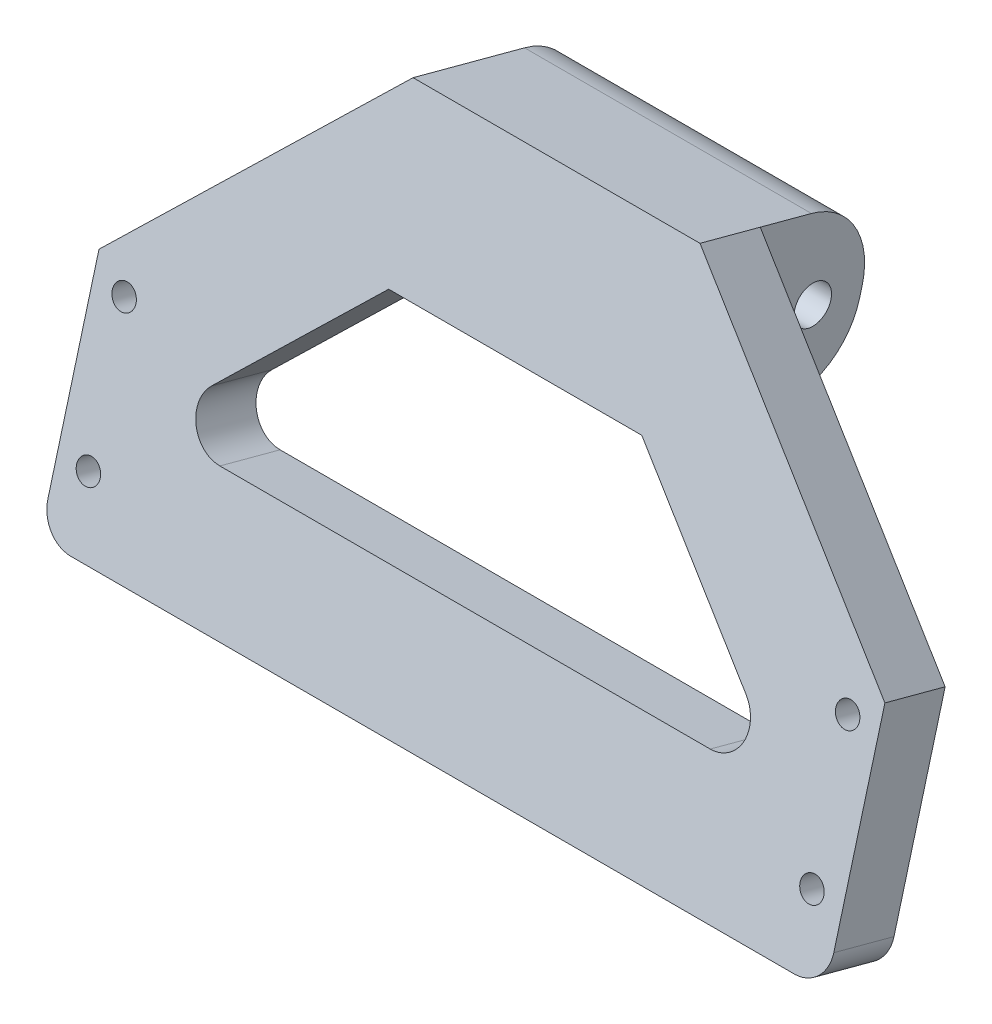
ISO-10303-21;
HEADER;
FILE_DESCRIPTION(('STEP AP214'),'2;1');
FILE_NAME('part.step','',(''),(''),'','','');
FILE_SCHEMA(('AUTOMOTIVE_DESIGN { 1 0 10303 214 1 1 1 1 }'));
ENDSEC;
DATA;
#1=APPLICATION_CONTEXT('core data for automotive mechanical design processes');
#2=APPLICATION_PROTOCOL_DEFINITION('international standard','automotive_design',2000,#1);
#3=PRODUCT_CONTEXT('',#1,'mechanical');
#4=PRODUCT('Part','Part','',(#3));
#5=PRODUCT_RELATED_PRODUCT_CATEGORY('part','',(#4));
#6=PRODUCT_DEFINITION_FORMATION('','',#4);
#7=PRODUCT_DEFINITION_CONTEXT('part definition',#1,'design');
#8=PRODUCT_DEFINITION('design','',#6,#7);
#9=PRODUCT_DEFINITION_SHAPE('','',#8);
#10=(LENGTH_UNIT() NAMED_UNIT(*) SI_UNIT(.MILLI.,.METRE.));
#11=(NAMED_UNIT(*) PLANE_ANGLE_UNIT() SI_UNIT($,.RADIAN.));
#12=(NAMED_UNIT(*) SI_UNIT($,.STERADIAN.) SOLID_ANGLE_UNIT());
#13=UNCERTAINTY_MEASURE_WITH_UNIT(LENGTH_MEASURE(1.E-05),#10,'distance_accuracy_value','');
#14=(GEOMETRIC_REPRESENTATION_CONTEXT(3) GLOBAL_UNCERTAINTY_ASSIGNED_CONTEXT((#13)) GLOBAL_UNIT_ASSIGNED_CONTEXT((#10,
#11,#12)) REPRESENTATION_CONTEXT('',''));
#15=CARTESIAN_POINT('',(0.,0.,0.));
#16=DIRECTION('',(0.,0.,1.));
#17=DIRECTION('',(1.,0.,0.));
#18=AXIS2_PLACEMENT_3D('',#15,#16,#17);
#19=CARTESIAN_POINT('',(-61.,57.4525619683472,40.7320818654844));
#20=DIRECTION('',(0.,0.258819045102521,0.965925826289068));
#21=DIRECTION('',(1.,0.,0.));
#22=AXIS2_PLACEMENT_3D('',#19,#20,#21);
#23=PLANE('',#22);
#24=CARTESIAN_POINT('',(-61.,52.2773266205377,42.1187819975709));
#25=DIRECTION('',(0.,-0.258819045102521,-0.965925826289068));
#26=DIRECTION('',(-1.,0.,0.));
#27=AXIS2_PLACEMENT_3D('',#24,#25,#26);
#28=CIRCLE('',#27,1.9);
#29=CARTESIAN_POINT('',(-59.1,52.2773266205377,42.1187819975709));
#30=VERTEX_POINT('',#29);
#31=EDGE_CURVE('E466',#30,#30,#28,.T.);
#32=ORIENTED_EDGE('',*,*,#31,.T.);
#33=EDGE_LOOP('',(#32));
#34=FACE_BOUND('',#33,.T.);
#35=CARTESIAN_POINT('',(-61.,73.6504575129133,36.3918688352342));
#36=DIRECTION('',(0.,-0.258819045102521,-0.965925826289068));
#37=DIRECTION('',(-1.,0.,0.));
#38=AXIS2_PLACEMENT_3D('',#35,#36,#37);
#39=CIRCLE('',#38,1.9);
#40=CARTESIAN_POINT('',(-59.1,73.6504575129133,36.3918688352342));
#41=VERTEX_POINT('',#40);
#42=EDGE_CURVE('E361',#41,#41,#39,.T.);
#43=ORIENTED_EDGE('',*,*,#42,.T.);
#44=EDGE_LOOP('',(#43));
#45=FACE_BOUND('',#44,.T.);
#46=CARTESIAN_POINT('',(55.,73.6504575129133,36.3918688352342));
#47=DIRECTION('',(0.,0.258819045102521,0.965925826289068));
#48=DIRECTION('',(1.,0.,0.));
#49=AXIS2_PLACEMENT_3D('',#46,#47,#48);
#50=CIRCLE('',#49,1.9);
#51=CARTESIAN_POINT('',(53.1,73.6504575129133,36.3918688352342));
#52=VERTEX_POINT('',#51);
#53=EDGE_CURVE('E388',#52,#52,#50,.T.);
#54=ORIENTED_EDGE('',*,*,#53,.F.);
#55=EDGE_LOOP('',(#54));
#56=FACE_BOUND('',#55,.T.);
#57=CARTESIAN_POINT('',(55.,52.2773266205377,42.1187819975709));
#58=DIRECTION('',(0.,0.258819045102521,0.965925826289068));
#59=DIRECTION('',(1.,0.,0.));
#60=AXIS2_PLACEMENT_3D('',#57,#58,#59);
#61=CIRCLE('',#60,1.9);
#62=CARTESIAN_POINT('',(53.1,52.2773266205377,42.1187819975709));
#63=VERTEX_POINT('',#62);
#64=EDGE_CURVE('E324',#63,#63,#61,.T.);
#65=ORIENTED_EDGE('',*,*,#64,.F.);
#66=EDGE_LOOP('',(#65));
#67=FACE_BOUND('',#66,.T.);
#68=DIRECTION('',(0.707106781186548,0.683012701892219,-0.183012701892219));
#69=VECTOR('',#68,1.);
#70=CARTESIAN_POINT('',(-45.7364567424983,69.5204929334043,37.4984895090828));
#71=LINE('',#70,#69);
#72=CARTESIAN_POINT('',(-45.8431521658773,69.4174330684156,37.5261043166786));
#73=VERTEX_POINT('',#72);
#74=CARTESIAN_POINT('',(-23.2877287525381,91.2042990662452,31.6883311669551));
#75=VERTEX_POINT('',#74);
#76=EDGE_CURVE('E548',#73,#75,#71,.T.);
#77=ORIENTED_EDGE('',*,*,#76,.T.);
#78=DIRECTION('',(1.,0.,0.));
#79=VECTOR('',#78,1.);
#80=CARTESIAN_POINT('',(-63.5,91.2042990662452,31.6883311669551));
#81=LINE('',#80,#79);
#82=CARTESIAN_POINT('',(17.2877287525381,91.2042990662452,31.6883311669551));
#83=VERTEX_POINT('',#82);
#84=EDGE_CURVE('E384',#75,#83,#81,.T.);
#85=ORIENTED_EDGE('',*,*,#84,.T.);
#86=DIRECTION('',(0.707106781186548,-0.683012701892219,0.183012701892219));
#87=VECTOR('',#86,1.);
#88=CARTESIAN_POINT('',(10.7364567424983,97.5323418957873,29.9927372011097));
#89=LINE('',#88,#87);
#90=CARTESIAN_POINT('',(39.8431521658774,69.4174330684156,37.5261043166786));
#91=VERTEX_POINT('',#90);
#92=EDGE_CURVE('E381',#83,#91,#89,.T.);
#93=ORIENTED_EDGE('',*,*,#92,.T.);
#94=CARTESIAN_POINT('',(36.3076182599446,66.0023695589546,38.4411678261396));
#95=DIRECTION('',(0.,0.258819045102521,0.965925826289068));
#96=DIRECTION('',(0.923879532511286,-0.369643810614387,0.0990457605412879));
#97=AXIS2_PLACEMENT_3D('',#94,#95,#96);
#98=CIRCLE('',#97,5.);
#99=CARTESIAN_POINT('',(36.3076182599446,61.1727404275092,39.7352630516522));
#100=VERTEX_POINT('',#99);
#101=EDGE_CURVE('E342',#100,#91,#98,.T.);
#102=ORIENTED_EDGE('',*,*,#101,.F.);
#103=DIRECTION('',(-1.,0.,0.));
#104=VECTOR('',#103,1.);
#105=CARTESIAN_POINT('',(-58.5,61.1727404275092,39.7352630516522));
#106=LINE('',#105,#104);
#107=CARTESIAN_POINT('',(-42.3076182599446,61.1727404275092,39.7352630516522));
#108=VERTEX_POINT('',#107);
#109=EDGE_CURVE('E399',#100,#108,#106,.T.);
#110=ORIENTED_EDGE('',*,*,#109,.T.);
#111=CARTESIAN_POINT('',(-42.3076182599446,66.0023695589546,38.4411678261396));
#112=DIRECTION('',(0.,0.258819045102521,0.965925826289068));
#113=DIRECTION('',(-0.923879532511286,-0.369643810614388,0.0990457605412881));
#114=AXIS2_PLACEMENT_3D('',#111,#112,#113);
#115=CIRCLE('',#114,5.);
#116=EDGE_CURVE('E395',#73,#108,#115,.T.);
#117=ORIENTED_EDGE('',*,*,#116,.F.);
#118=EDGE_LOOP('',(#77,#85,#93,#102,#110,#117));
#119=FACE_BOUND('',#118,.T.);
#120=DIRECTION('',(0.,-0.965925826289069,0.25881904510252));
#121=VECTOR('',#120,1.);
#122=CARTESIAN_POINT('',(-66.,52.9380237073335,41.9417487467224));
#123=LINE('',#122,#121);
#124=CARTESIAN_POINT('',(-66.,77.2679212445465,35.4225723496942));
#125=VERTEX_POINT('',#124);
#126=CARTESIAN_POINT('',(-66.,46.6838530331732,43.6175487281901));
#127=VERTEX_POINT('',#126);
#128=EDGE_CURVE('E376',#125,#127,#123,.T.);
#129=ORIENTED_EDGE('',*,*,#128,.T.);
#130=CARTESIAN_POINT('',(-61.,46.6838530331732,43.6175487281901));
#131=DIRECTION('',(0.,-0.258819045102521,-0.965925826289068));
#132=DIRECTION('',(-0.707106781186548,-0.683012701892219,0.183012701892219));
#133=AXIS2_PLACEMENT_3D('',#130,#131,#132);
#134=CIRCLE('',#133,5.);
#135=CARTESIAN_POINT('',(-61.,41.8542239017278,44.9116439537027));
#136=VERTEX_POINT('',#135);
#137=EDGE_CURVE('E299',#136,#127,#134,.T.);
#138=ORIENTED_EDGE('',*,*,#137,.F.);
#139=DIRECTION('',(1.,0.,0.));
#140=VECTOR('',#139,1.);
#141=CARTESIAN_POINT('',(-58.5,41.8542239017278,44.9116439537027));
#142=LINE('',#141,#140);
#143=CARTESIAN_POINT('',(55.,41.8542239017278,44.9116439537027));
#144=VERTEX_POINT('',#143);
#145=EDGE_CURVE('E302',#136,#144,#142,.T.);
#146=ORIENTED_EDGE('',*,*,#145,.T.);
#147=CARTESIAN_POINT('',(55.,46.6838530331732,43.6175487281901));
#148=DIRECTION('',(0.,0.258819045102521,0.965925826289068));
#149=DIRECTION('',(0.707106781186548,-0.683012701892219,0.183012701892219));
#150=AXIS2_PLACEMENT_3D('',#147,#148,#149);
#151=CIRCLE('',#150,5.);
#152=CARTESIAN_POINT('',(60.,46.6838530331732,43.6175487281901));
#153=VERTEX_POINT('',#152);
#154=EDGE_CURVE('E442',#144,#153,#151,.T.);
#155=ORIENTED_EDGE('',*,*,#154,.T.);
#156=DIRECTION('',(0.,-0.965925826289069,0.25881904510252));
#157=VECTOR('',#156,1.);
#158=CARTESIAN_POINT('',(60.,52.9380237073335,41.9417487467224));
#159=LINE('',#158,#157);
#160=CARTESIAN_POINT('',(60.,77.2679212445465,35.4225723496942));
#161=VERTEX_POINT('',#160);
#162=EDGE_CURVE('E451',#161,#153,#159,.T.);
#163=ORIENTED_EDGE('',*,*,#162,.F.);
#164=DIRECTION('',(-0.707106781186548,0.683012701892219,-0.183012701892219));
#165=VECTOR('',#164,1.);
#166=CARTESIAN_POINT('',(24.8785923662293,111.192595933632,26.3324831632653));
#167=LINE('',#166,#165);
#168=CARTESIAN_POINT('',(20.,115.904954296109,25.0698105455934));
#169=VERTEX_POINT('',#168);
#170=EDGE_CURVE('E28',#161,#169,#167,.T.);
#171=ORIENTED_EDGE('',*,*,#170,.T.);
#172=DIRECTION('',(-1.,0.,0.));
#173=VECTOR('',#172,1.);
#174=CARTESIAN_POINT('',(-63.5,115.904954296109,25.0698105455934));
#175=LINE('',#174,#173);
#176=CARTESIAN_POINT('',(-26.,115.904954296109,25.0698105455934));
#177=VERTEX_POINT('',#176);
#178=EDGE_CURVE('E372',#169,#177,#175,.T.);
#179=ORIENTED_EDGE('',*,*,#178,.T.);
#180=DIRECTION('',(0.707106781186548,0.683012701892219,-0.183012701892219));
#181=VECTOR('',#180,1.);
#182=CARTESIAN_POINT('',(-59.8785923662293,83.1807469712487,33.8382354712384));
#183=LINE('',#182,#181);
#184=EDGE_CURVE('E377',#125,#177,#183,.T.);
#185=ORIENTED_EDGE('',*,*,#184,.F.);
#186=EDGE_LOOP('',(#129,#138,#146,#155,#163,#171,#179,#185));
#187=FACE_BOUND('',#186,.T.);
#188=ADVANCED_FACE('F17',(#34,#45,#56,#67,#119,#187),#23,.T.);
#189=CARTESIAN_POINT('',(20.,89.5823235725168,21.7701763865418));
#190=DIRECTION('',(0.,-0.965925826289068,0.258819045102521));
#191=DIRECTION('',(-1.,0.,0.));
#192=AXIS2_PLACEMENT_3D('',#189,#190,#191);
#193=PLANE('',#192);
#194=DIRECTION('',(-1.,0.,0.));
#195=VECTOR('',#194,1.);
#196=CARTESIAN_POINT('',(14.5,89.5823235725168,21.7701763865418));
#197=LINE('',#196,#195);
#198=CARTESIAN_POINT('',(20.,89.5823235725168,21.7701763865418));
#199=VERTEX_POINT('',#198);
#200=CARTESIAN_POINT('',(-26.,89.5823235725168,21.7701763865418));
#201=VERTEX_POINT('',#200);
#202=EDGE_CURVE('E404',#199,#201,#197,.T.);
#203=ORIENTED_EDGE('',*,*,#202,.T.);
#204=DIRECTION('',(0.,-0.25881904510252,-0.965925826289069));
#205=VECTOR('',#204,1.);
#206=CARTESIAN_POINT('',(-26.,89.5823235725168,21.7701763865418));
#207=LINE('',#206,#205);
#208=CARTESIAN_POINT('',(-26.,87.3823616891454,13.5598068630847));
#209=VERTEX_POINT('',#208);
#210=EDGE_CURVE('E514',#201,#209,#207,.T.);
#211=ORIENTED_EDGE('',*,*,#210,.T.);
#212=DIRECTION('',(-1.,0.,0.));
#213=VECTOR('',#212,1.);
#214=CARTESIAN_POINT('',(8.5,87.3823616891454,13.5598068630847));
#215=LINE('',#214,#213);
#216=CARTESIAN_POINT('',(20.,87.3823616891454,13.5598068630847));
#217=VERTEX_POINT('',#216);
#218=EDGE_CURVE('E336',#217,#209,#215,.T.);
#219=ORIENTED_EDGE('',*,*,#218,.F.);
#220=DIRECTION('',(0.,-0.25881904510252,-0.965925826289069));
#221=VECTOR('',#220,1.);
#222=CARTESIAN_POINT('',(20.,89.5823235725168,21.7701763865418));
#223=LINE('',#222,#221);
#224=EDGE_CURVE('E11',#199,#217,#223,.T.);
#225=ORIENTED_EDGE('',*,*,#224,.F.);
#226=EDGE_LOOP('',(#203,#211,#219,#225));
#227=FACE_BOUND('',#226,.T.);
#228=ADVANCED_FACE('F644',(#227),#193,.T.);
#229=CARTESIAN_POINT('',(20.,89.5823235725168,21.7701763865418));
#230=DIRECTION('',(-1.,0.,0.));
#231=DIRECTION('',(0.,0.,1.));
#232=AXIS2_PLACEMENT_3D('',#229,#230,#231);
#233=PLANE('',#232);
#234=CARTESIAN_POINT('',(20.,98.3380441089851,6.97808974038123));
#235=DIRECTION('',(1.,0.,0.));
#236=DIRECTION('',(0.,0.965925826289068,-0.258819045102521));
#237=AXIS2_PLACEMENT_3D('',#234,#235,#236);
#238=CIRCLE('',#237,3.);
#239=CARTESIAN_POINT('',(20.,95.4402666301179,7.75454687568879));
#240=VERTEX_POINT('',#239);
#241=EDGE_CURVE('E523',#240,#240,#238,.T.);
#242=ORIENTED_EDGE('',*,*,#241,.F.);
#243=EDGE_LOOP('',(#242));
#244=FACE_BOUND('',#243,.T.);
#245=CARTESIAN_POINT('',(20.,98.4905086914697,10.5833878444057));
#246=DIRECTION('',(1.,0.,0.));
#247=DIRECTION('',(0.,-0.866025403784439,-0.5));
#248=AXIS2_PLACEMENT_3D('',#245,#246,#247);
#249=CIRCLE('',#248,11.5);
#250=CARTESIAN_POINT('',(20.,95.5140896727907,-0.524759157918545));
#251=VERTEX_POINT('',#250);
#252=EDGE_CURVE('E313',#217,#251,#249,.T.);
#253=ORIENTED_EDGE('',*,*,#252,.T.);
#254=DIRECTION('',(0.,0.965925826289069,-0.25881904510252));
#255=VECTOR('',#254,1.);
#256=CARTESIAN_POINT('',(20.,90.3395527386082,0.861753834800667));
#257=LINE('',#256,#255);
#258=CARTESIAN_POINT('',(20.,97.0322359407093,-0.931545224399665));
#259=VERTEX_POINT('',#258);
#260=EDGE_CURVE('E277',#251,#259,#257,.T.);
#261=ORIENTED_EDGE('',*,*,#260,.T.);
#262=CARTESIAN_POINT('',(20.,100.008654959388,10.1766017779246));
#263=DIRECTION('',(1.,0.,0.));
#264=DIRECTION('',(0.,0.5,-0.866025403784438));
#265=AXIS2_PLACEMENT_3D('',#262,#263,#264);
#266=CIRCLE('',#265,11.5);
#267=CARTESIAN_POINT('',(20.,111.116801961713,7.20018275924564));
#268=VERTEX_POINT('',#267);
#269=EDGE_CURVE('E274',#259,#268,#266,.T.);
#270=ORIENTED_EDGE('',*,*,#269,.T.);
#271=DIRECTION('',(0.,-0.25881904510252,-0.965925826289069));
#272=VECTOR('',#271,1.);
#273=CARTESIAN_POINT('',(20.,114.610859070597,20.2401814141481));
#274=LINE('',#273,#272);
#275=CARTESIAN_POINT('',(20.,113.316763845084,15.4105522827027));
#276=VERTEX_POINT('',#275);
#277=EDGE_CURVE('E258',#276,#268,#274,.T.);
#278=ORIENTED_EDGE('',*,*,#277,.F.);
#279=DIRECTION('',(0.,-0.965925826289069,0.25881904510252));
#280=VECTOR('',#279,1.);
#281=CARTESIAN_POINT('',(20.,72.2233475449194,26.4214999945677));
#282=LINE('',#281,#280);
#283=EDGE_CURVE('E400',#276,#199,#282,.T.);
#284=ORIENTED_EDGE('',*,*,#283,.T.);
#285=ORIENTED_EDGE('',*,*,#224,.T.);
#286=EDGE_LOOP('',(#253,#261,#270,#278,#284,#285));
#287=FACE_BOUND('',#286,.T.);
#288=ADVANCED_FACE('F275',(#244,#287),#233,.F.);
#289=CARTESIAN_POINT('',(40.,96.5864377703279,30.2461914476438));
#290=DIRECTION('',(-0.707106781186548,-0.683012701892219,0.183012701892219));
#291=DIRECTION('',(-0.694746590606865,0.719254596676404,0.));
#292=AXIS2_PLACEMENT_3D('',#289,#290,#291);
#293=PLANE('',#292);
#294=DIRECTION('',(0.707106781186548,-0.683012701892219,0.183012701892219));
#295=VECTOR('',#294,1.);
#296=CARTESIAN_POINT('',(53.8785923662293,80.5925565202235,24.1789772083477));
#297=LINE('',#296,#295);
#298=CARTESIAN_POINT('',(60.,74.6797307935213,25.7633140868035));
#299=VERTEX_POINT('',#298);
#300=EDGE_CURVE('E403',#276,#299,#297,.T.);
#301=ORIENTED_EDGE('',*,*,#300,.F.);
#302=DIRECTION('',(0.,-0.25881904510252,-0.965925826289069));
#303=VECTOR('',#302,1.);
#304=CARTESIAN_POINT('',(20.,115.904954296109,25.0698105455934));
#305=LINE('',#304,#303);
#306=EDGE_CURVE('E266',#169,#276,#305,.T.);
#307=ORIENTED_EDGE('',*,*,#306,.F.);
#308=ORIENTED_EDGE('',*,*,#170,.F.);
#309=DIRECTION('',(0.,0.25881904510252,0.965925826289069));
#310=VECTOR('',#309,1.);
#311=CARTESIAN_POINT('',(60.,77.2679212445465,35.4225723496942));
#312=LINE('',#311,#310);
#313=EDGE_CURVE('E446',#299,#161,#312,.T.);
#314=ORIENTED_EDGE('',*,*,#313,.F.);
#315=EDGE_LOOP('',(#301,#307,#308,#314));
#316=FACE_BOUND('',#315,.T.);
#317=ADVANCED_FACE('F596',(#316),#293,.F.);
#318=CARTESIAN_POINT('',(60.,48.4234854463198,43.1514156279604));
#319=DIRECTION('',(-1.,0.,0.));
#320=DIRECTION('',(0.,0.,1.));
#321=AXIS2_PLACEMENT_3D('',#318,#319,#320);
#322=PLANE('',#321);
#323=DIRECTION('',(0.,-0.25881904510252,-0.965925826289069));
#324=VECTOR('',#323,1.);
#325=CARTESIAN_POINT('',(60.,46.6838530331732,43.6175487281901));
#326=LINE('',#325,#324);
#327=CARTESIAN_POINT('',(60.,44.095662582148,33.9582904652994));
#328=VERTEX_POINT('',#327);
#329=EDGE_CURVE('E318',#153,#328,#326,.T.);
#330=ORIENTED_EDGE('',*,*,#329,.T.);
#331=DIRECTION('',(0.,0.965925826289069,-0.25881904510252));
#332=VECTOR('',#331,1.);
#333=CARTESIAN_POINT('',(60.,30.6633293572501,37.5574733053765));
#334=LINE('',#333,#332);
#335=EDGE_CURVE('E333',#328,#299,#334,.T.);
#336=ORIENTED_EDGE('',*,*,#335,.T.);
#337=ORIENTED_EDGE('',*,*,#313,.T.);
#338=ORIENTED_EDGE('',*,*,#162,.T.);
#339=EDGE_LOOP('',(#330,#336,#337,#338));
#340=FACE_BOUND('',#339,.T.);
#341=ADVANCED_FACE('F592',(#340),#322,.F.);
#342=CARTESIAN_POINT('',(55.,46.6838530331732,43.6175487281901));
#343=DIRECTION('',(0.,0.258819045102521,0.965925826289068));
#344=DIRECTION('',(0.707106781186548,-0.683012701892219,0.183012701892219));
#345=AXIS2_PLACEMENT_3D('',#342,#343,#344);
#346=CYLINDRICAL_SURFACE('',#345,5.);
#347=CARTESIAN_POINT('',(55.,44.095662582148,33.9582904652994));
#348=DIRECTION('',(0.,-0.258819045102521,-0.965925826289068));
#349=DIRECTION('',(0.707106781186548,-0.683012701892219,0.183012701892219));
#350=AXIS2_PLACEMENT_3D('',#347,#348,#349);
#351=CIRCLE('',#350,5.);
#352=CARTESIAN_POINT('',(55.,39.2660334507026,35.252385690812));
#353=VERTEX_POINT('',#352);
#354=EDGE_CURVE('E328',#328,#353,#351,.T.);
#355=ORIENTED_EDGE('',*,*,#354,.F.);
#356=ORIENTED_EDGE('',*,*,#329,.F.);
#357=ORIENTED_EDGE('',*,*,#154,.F.);
#358=DIRECTION('',(0.,0.25881904510252,0.965925826289069));
#359=VECTOR('',#358,1.);
#360=CARTESIAN_POINT('',(55.,41.8542239017278,44.9116439537027));
#361=LINE('',#360,#359);
#362=EDGE_CURVE('E314',#353,#144,#361,.T.);
#363=ORIENTED_EDGE('',*,*,#362,.F.);
#364=EDGE_LOOP('',(#355,#356,#357,#363));
#365=FACE_BOUND('',#364,.T.);
#366=ADVANCED_FACE('F590',(#365),#346,.T.);
#367=CARTESIAN_POINT('',(-56.,41.8542239017278,44.9116439537027));
#368=DIRECTION('',(0.,-0.965925826289068,0.258819045102521));
#369=DIRECTION('',(-1.,0.,0.));
#370=AXIS2_PLACEMENT_3D('',#367,#368,#369);
#371=PLANE('',#370);
#372=CARTESIAN_POINT('',(-45.0000008940697,40.5601285026636,40.0820141745536));
#373=DIRECTION('',(0.,0.965925826289068,-0.258819045102521));
#374=DIRECTION('',(1.,0.,0.));
#375=AXIS2_PLACEMENT_3D('',#372,#373,#374);
#376=CIRCLE('',#375,1.4);
#377=CARTESIAN_POINT('',(-46.4000008940697,40.5601285026636,40.0820141745536));
#378=VERTEX_POINT('',#377);
#379=EDGE_CURVE('E391',#378,#378,#376,.T.);
#380=ORIENTED_EDGE('',*,*,#379,.T.);
#381=EDGE_LOOP('',(#380));
#382=FACE_BOUND('',#381,.T.);
#383=CARTESIAN_POINT('',(39.0000008940697,40.5601285026636,40.0820141745536));
#384=DIRECTION('',(0.,-0.965925826289068,0.258819045102521));
#385=DIRECTION('',(-1.,0.,0.));
#386=AXIS2_PLACEMENT_3D('',#383,#384,#385);
#387=CIRCLE('',#386,1.4);
#388=CARTESIAN_POINT('',(40.4000008940697,40.5601285026636,40.0820141745536));
#389=VERTEX_POINT('',#388);
#390=EDGE_CURVE('E337',#389,#389,#387,.T.);
#391=ORIENTED_EDGE('',*,*,#390,.F.);
#392=EDGE_LOOP('',(#391));
#393=FACE_BOUND('',#392,.T.);
#394=ORIENTED_EDGE('',*,*,#145,.F.);
#395=DIRECTION('',(0.,0.25881904510252,0.965925826289069));
#396=VECTOR('',#395,1.);
#397=CARTESIAN_POINT('',(-61.,41.8542239017278,44.9116439537027));
#398=LINE('',#397,#396);
#399=CARTESIAN_POINT('',(-61.,39.2660334507026,35.252385690812));
#400=VERTEX_POINT('',#399);
#401=EDGE_CURVE('E303',#400,#136,#398,.T.);
#402=ORIENTED_EDGE('',*,*,#401,.F.);
#403=DIRECTION('',(-1.,0.,0.));
#404=VECTOR('',#403,1.);
#405=CARTESIAN_POINT('',(-58.5,39.2660334507026,35.252385690812));
#406=LINE('',#405,#404);
#407=EDGE_CURVE('E332',#353,#400,#406,.T.);
#408=ORIENTED_EDGE('',*,*,#407,.F.);
#409=ORIENTED_EDGE('',*,*,#362,.T.);
#410=EDGE_LOOP('',(#394,#402,#408,#409));
#411=FACE_BOUND('',#410,.T.);
#412=ADVANCED_FACE('F586',(#382,#393,#411),#371,.T.);
#413=CARTESIAN_POINT('',(-61.,46.6838530331732,43.6175487281901));
#414=DIRECTION('',(0.,-0.258819045102521,-0.965925826289068));
#415=DIRECTION('',(-0.707106781186548,-0.683012701892219,0.183012701892219));
#416=AXIS2_PLACEMENT_3D('',#413,#414,#415);
#417=CYLINDRICAL_SURFACE('',#416,5.);
#418=CARTESIAN_POINT('',(-61.,44.095662582148,33.9582904652994));
#419=DIRECTION('',(0.,0.258819045102521,0.965925826289068));
#420=DIRECTION('',(-0.707106781186548,-0.683012701892219,0.183012701892219));
#421=AXIS2_PLACEMENT_3D('',#418,#419,#420);
#422=CIRCLE('',#421,5.);
#423=CARTESIAN_POINT('',(-66.,44.095662582148,33.9582904652994));
#424=VERTEX_POINT('',#423);
#425=EDGE_CURVE('E351',#424,#400,#422,.T.);
#426=ORIENTED_EDGE('',*,*,#425,.T.);
#427=ORIENTED_EDGE('',*,*,#401,.T.);
#428=ORIENTED_EDGE('',*,*,#137,.T.);
#429=DIRECTION('',(0.,-0.25881904510252,-0.965925826289069));
#430=VECTOR('',#429,1.);
#431=CARTESIAN_POINT('',(-66.,46.6838530331732,43.6175487281901));
#432=LINE('',#431,#430);
#433=EDGE_CURVE('E373',#127,#424,#432,.T.);
#434=ORIENTED_EDGE('',*,*,#433,.T.);
#435=EDGE_LOOP('',(#426,#427,#428,#434));
#436=FACE_BOUND('',#435,.T.);
#437=ADVANCED_FACE('F583',(#436),#417,.T.);
#438=CARTESIAN_POINT('',(-66.,48.4234854463198,43.1514156279604));
#439=DIRECTION('',(-1.,0.,0.));
#440=DIRECTION('',(0.,0.,1.));
#441=AXIS2_PLACEMENT_3D('',#438,#439,#440);
#442=PLANE('',#441);
#443=ORIENTED_EDGE('',*,*,#433,.F.);
#444=ORIENTED_EDGE('',*,*,#128,.F.);
#445=DIRECTION('',(0.,0.25881904510252,0.965925826289069));
#446=VECTOR('',#445,1.);
#447=CARTESIAN_POINT('',(-66.,77.2679212445465,35.4225723496942));
#448=LINE('',#447,#446);
#449=CARTESIAN_POINT('',(-66.,74.6797307935213,25.7633140868035));
#450=VERTEX_POINT('',#449);
#451=EDGE_CURVE('E422',#450,#125,#448,.T.);
#452=ORIENTED_EDGE('',*,*,#451,.F.);
#453=DIRECTION('',(0.,0.965925826289069,-0.25881904510252));
#454=VECTOR('',#453,1.);
#455=CARTESIAN_POINT('',(-66.,30.6633293572501,37.5574733053765));
#456=LINE('',#455,#454);
#457=EDGE_CURVE('E491',#424,#450,#456,.T.);
#458=ORIENTED_EDGE('',*,*,#457,.F.);
#459=EDGE_LOOP('',(#443,#444,#452,#458));
#460=FACE_BOUND('',#459,.T.);
#461=ADVANCED_FACE('F582',(#460),#442,.T.);
#462=CARTESIAN_POINT('',(-46.,96.5864377703279,30.2461914476438));
#463=DIRECTION('',(-0.707106781186548,0.683012701892219,-0.183012701892219));
#464=DIRECTION('',(-0.250562807085731,0.,0.968100345886375));
#465=AXIS2_PLACEMENT_3D('',#462,#463,#464);
#466=PLANE('',#465);
#467=DIRECTION('',(-0.707106781186548,-0.683012701892219,0.183012701892219));
#468=VECTOR('',#467,1.);
#469=CARTESIAN_POINT('',(-59.8785923662293,80.5925565202235,24.1789772083477));
#470=LINE('',#469,#468);
#471=CARTESIAN_POINT('',(-26.,113.316763845084,15.4105522827027));
#472=VERTEX_POINT('',#471);
#473=EDGE_CURVE('E498',#472,#450,#470,.T.);
#474=ORIENTED_EDGE('',*,*,#473,.T.);
#475=ORIENTED_EDGE('',*,*,#451,.T.);
#476=ORIENTED_EDGE('',*,*,#184,.T.);
#477=DIRECTION('',(0.,-0.25881904510252,-0.965925826289069));
#478=VECTOR('',#477,1.);
#479=CARTESIAN_POINT('',(-26.,115.904954296109,25.0698105455934));
#480=LINE('',#479,#478);
#481=EDGE_CURVE('E312',#177,#472,#480,.T.);
#482=ORIENTED_EDGE('',*,*,#481,.T.);
#483=EDGE_LOOP('',(#474,#475,#476,#482));
#484=FACE_BOUND('',#483,.T.);
#485=ADVANCED_FACE('F600',(#484),#466,.T.);
#486=CARTESIAN_POINT('',(-26.,89.5823235725168,21.7701763865418));
#487=DIRECTION('',(-1.,0.,0.));
#488=DIRECTION('',(0.,0.,1.));
#489=AXIS2_PLACEMENT_3D('',#486,#487,#488);
#490=PLANE('',#489);
#491=CARTESIAN_POINT('',(-26.,98.3380441089851,6.97808974038123));
#492=DIRECTION('',(1.,0.,0.));
#493=DIRECTION('',(0.,0.965925826289068,-0.258819045102521));
#494=AXIS2_PLACEMENT_3D('',#491,#492,#493);
#495=CIRCLE('',#494,3.);
#496=CARTESIAN_POINT('',(-26.,95.4402666301179,7.75454687568879));
#497=VERTEX_POINT('',#496);
#498=EDGE_CURVE('E352',#497,#497,#495,.T.);
#499=ORIENTED_EDGE('',*,*,#498,.T.);
#500=EDGE_LOOP('',(#499));
#501=FACE_BOUND('',#500,.T.);
#502=CARTESIAN_POINT('',(-26.,98.4905086914697,10.5833878444057));
#503=DIRECTION('',(1.,0.,0.));
#504=DIRECTION('',(0.,-0.866025403784439,-0.5));
#505=AXIS2_PLACEMENT_3D('',#502,#503,#504);
#506=CIRCLE('',#505,11.5);
#507=CARTESIAN_POINT('',(-26.,95.5140896727907,-0.524759157918545));
#508=VERTEX_POINT('',#507);
#509=EDGE_CURVE('E364',#209,#508,#506,.T.);
#510=ORIENTED_EDGE('',*,*,#509,.F.);
#511=ORIENTED_EDGE('',*,*,#210,.F.);
#512=DIRECTION('',(0.,-0.965925826289069,0.25881904510252));
#513=VECTOR('',#512,1.);
#514=CARTESIAN_POINT('',(-26.,72.2233475449194,26.4214999945677));
#515=LINE('',#514,#513);
#516=EDGE_CURVE('E488',#472,#201,#515,.T.);
#517=ORIENTED_EDGE('',*,*,#516,.F.);
#518=DIRECTION('',(0.,-0.25881904510252,-0.965925826289069));
#519=VECTOR('',#518,1.);
#520=CARTESIAN_POINT('',(-26.,114.610859070597,20.2401814141481));
#521=LINE('',#520,#519);
#522=CARTESIAN_POINT('',(-26.,111.116801961713,7.20018275924564));
#523=VERTEX_POINT('',#522);
#524=EDGE_CURVE('E309',#472,#523,#521,.T.);
#525=ORIENTED_EDGE('',*,*,#524,.T.);
#526=CARTESIAN_POINT('',(-26.,100.008654959388,10.1766017779246));
#527=DIRECTION('',(1.,0.,0.));
#528=DIRECTION('',(0.,0.5,-0.866025403784438));
#529=AXIS2_PLACEMENT_3D('',#526,#527,#528);
#530=CIRCLE('',#529,11.5);
#531=CARTESIAN_POINT('',(-26.,97.0322359407093,-0.931545224399665));
#532=VERTEX_POINT('',#531);
#533=EDGE_CURVE('E286',#532,#523,#530,.T.);
#534=ORIENTED_EDGE('',*,*,#533,.F.);
#535=DIRECTION('',(0.,0.965925826289069,-0.25881904510252));
#536=VECTOR('',#535,1.);
#537=CARTESIAN_POINT('',(-26.,90.3395527386082,0.861753834800667));
#538=LINE('',#537,#536);
#539=EDGE_CURVE('E325',#508,#532,#538,.T.);
#540=ORIENTED_EDGE('',*,*,#539,.F.);
#541=EDGE_LOOP('',(#510,#511,#517,#525,#534,#540));
#542=FACE_BOUND('',#541,.T.);
#543=ADVANCED_FACE('F654',(#501,#542),#490,.T.);
#544=CARTESIAN_POINT('',(-61.,49.947955214615,33.4254495609693));
#545=DIRECTION('',(0.,-0.258819045102521,-0.965925826289068));
#546=DIRECTION('',(-1.,0.,0.));
#547=AXIS2_PLACEMENT_3D('',#544,#545,#546);
#548=CONICAL_SURFACE('',#547,2.9,0.785398163397448);
#549=CARTESIAN_POINT('',(-61.,49.6891361695125,32.4595237346802));
#550=DIRECTION('',(0.,-0.258819045102521,-0.965925826289068));
#551=DIRECTION('',(-1.,0.,0.));
#552=AXIS2_PLACEMENT_3D('',#549,#550,#551);
#553=CIRCLE('',#552,3.9);
#554=CARTESIAN_POINT('',(-57.1,49.6891361695125,32.4595237346802));
#555=VERTEX_POINT('',#554);
#556=EDGE_CURVE('E485',#555,#555,#553,.T.);
#557=ORIENTED_EDGE('',*,*,#556,.T.);
#558=DIRECTION('',(-0.707106781186548,0.183012701892219,0.683012701892219));
#559=VECTOR('',#558,1.);
#560=CARTESIAN_POINT('',(-58.1,49.947955214615,33.4254495609693));
#561=LINE('',#560,#559);
#562=CARTESIAN_POINT('',(-59.1,50.2067742597176,34.3913753872584));
#563=VERTEX_POINT('',#562);
#564=EDGE_CURVE('E439',#555,#563,#561,.T.);
#565=ORIENTED_EDGE('',*,*,#564,.T.);
#566=CARTESIAN_POINT('',(-61.,50.2067742597176,34.3913753872584));
#567=DIRECTION('',(0.,0.258819045102521,0.965925826289068));
#568=DIRECTION('',(-1.,0.,0.));
#569=AXIS2_PLACEMENT_3D('',#566,#567,#568);
#570=CIRCLE('',#569,1.9);
#571=EDGE_CURVE('E356',#563,#563,#570,.T.);
#572=ORIENTED_EDGE('',*,*,#571,.T.);
#573=ORIENTED_EDGE('',*,*,#564,.F.);
#574=EDGE_LOOP('',(#557,#565,#572,#573));
#575=FACE_BOUND('',#574,.T.);
#576=ADVANCED_FACE('F656',(#575),#548,.F.);
#577=CARTESIAN_POINT('',(55.,49.947955214615,33.4254495609693));
#578=DIRECTION('',(0.,-0.258819045102521,-0.965925826289068));
#579=DIRECTION('',(1.,0.,0.));
#580=AXIS2_PLACEMENT_3D('',#577,#578,#579);
#581=CONICAL_SURFACE('',#580,2.9,0.785398163397448);
#582=CARTESIAN_POINT('',(55.,50.2067742597176,34.3913753872584));
#583=DIRECTION('',(0.,0.258819045102521,0.965925826289068));
#584=DIRECTION('',(1.,0.,0.));
#585=AXIS2_PLACEMENT_3D('',#582,#583,#584);
#586=CIRCLE('',#585,1.9);
#587=CARTESIAN_POINT('',(53.1,50.2067742597176,34.3913753872584));
#588=VERTEX_POINT('',#587);
#589=EDGE_CURVE('E369',#588,#588,#586,.T.);
#590=ORIENTED_EDGE('',*,*,#589,.T.);
#591=DIRECTION('',(-0.707106781186548,-0.183012701892219,-0.683012701892219));
#592=VECTOR('',#591,1.);
#593=CARTESIAN_POINT('',(52.1,49.947955214615,33.4254495609693));
#594=LINE('',#593,#592);
#595=CARTESIAN_POINT('',(51.1,49.6891361695125,32.4595237346802));
#596=VERTEX_POINT('',#595);
#597=EDGE_CURVE('E436',#588,#596,#594,.T.);
#598=ORIENTED_EDGE('',*,*,#597,.T.);
#599=CARTESIAN_POINT('',(55.,49.6891361695125,32.4595237346802));
#600=DIRECTION('',(0.,-0.258819045102521,-0.965925826289068));
#601=DIRECTION('',(1.,0.,0.));
#602=AXIS2_PLACEMENT_3D('',#599,#600,#601);
#603=CIRCLE('',#602,3.9);
#604=EDGE_CURVE('E473',#596,#596,#603,.T.);
#605=ORIENTED_EDGE('',*,*,#604,.T.);
#606=ORIENTED_EDGE('',*,*,#597,.F.);
#607=EDGE_LOOP('',(#590,#598,#605,#606));
#608=FACE_BOUND('',#607,.T.);
#609=ADVANCED_FACE('F665',(#608),#581,.F.);
#610=CARTESIAN_POINT('',(55.,71.3210861069906,27.6985363986326));
#611=DIRECTION('',(0.,-0.258819045102521,-0.965925826289068));
#612=DIRECTION('',(1.,0.,0.));
#613=AXIS2_PLACEMENT_3D('',#610,#611,#612);
#614=CONICAL_SURFACE('',#613,2.9,0.785398163397448);
#615=CARTESIAN_POINT('',(55.,71.5799051520932,28.6644622249217));
#616=DIRECTION('',(0.,0.258819045102521,0.965925826289068));
#617=DIRECTION('',(1.,0.,0.));
#618=AXIS2_PLACEMENT_3D('',#615,#616,#617);
#619=CIRCLE('',#618,1.9);
#620=CARTESIAN_POINT('',(53.1,71.5799051520932,28.6644622249217));
#621=VERTEX_POINT('',#620);
#622=EDGE_CURVE('E319',#621,#621,#619,.T.);
#623=ORIENTED_EDGE('',*,*,#622,.T.);
#624=DIRECTION('',(-0.707106781186548,-0.183012701892219,-0.683012701892219));
#625=VECTOR('',#624,1.);
#626=CARTESIAN_POINT('',(52.1,71.3210861069906,27.6985363986326));
#627=LINE('',#626,#625);
#628=CARTESIAN_POINT('',(51.1,71.0622670618881,26.7326105723435));
#629=VERTEX_POINT('',#628);
#630=EDGE_CURVE('E297',#621,#629,#627,.T.);
#631=ORIENTED_EDGE('',*,*,#630,.T.);
#632=CARTESIAN_POINT('',(55.,71.0622670618881,26.7326105723435));
#633=DIRECTION('',(0.,-0.258819045102521,-0.965925826289068));
#634=DIRECTION('',(1.,0.,0.));
#635=AXIS2_PLACEMENT_3D('',#632,#633,#634);
#636=CIRCLE('',#635,3.9);
#637=EDGE_CURVE('E307',#629,#629,#636,.T.);
#638=ORIENTED_EDGE('',*,*,#637,.T.);
#639=ORIENTED_EDGE('',*,*,#630,.F.);
#640=EDGE_LOOP('',(#623,#631,#638,#639));
#641=FACE_BOUND('',#640,.T.);
#642=ADVANCED_FACE('F19',(#641),#614,.F.);
#643=CARTESIAN_POINT('',(-61.,71.3210861069906,27.6985363986326));
#644=DIRECTION('',(0.,-0.258819045102521,-0.965925826289068));
#645=DIRECTION('',(-1.,0.,0.));
#646=AXIS2_PLACEMENT_3D('',#643,#644,#645);
#647=CONICAL_SURFACE('',#646,2.9,0.785398163397448);
#648=CARTESIAN_POINT('',(-61.,71.0622670618881,26.7326105723435));
#649=DIRECTION('',(0.,-0.258819045102521,-0.965925826289068));
#650=DIRECTION('',(-1.,0.,0.));
#651=AXIS2_PLACEMENT_3D('',#648,#649,#650);
#652=CIRCLE('',#651,3.9);
#653=CARTESIAN_POINT('',(-57.1,71.0622670618881,26.7326105723435));
#654=VERTEX_POINT('',#653);
#655=EDGE_CURVE('E464',#654,#654,#652,.T.);
#656=ORIENTED_EDGE('',*,*,#655,.T.);
#657=DIRECTION('',(-0.707106781186548,0.183012701892219,0.683012701892219));
#658=VECTOR('',#657,1.);
#659=CARTESIAN_POINT('',(-58.1,71.3210861069906,27.6985363986326));
#660=LINE('',#659,#658);
#661=CARTESIAN_POINT('',(-59.1,71.5799051520932,28.6644622249217));
#662=VERTEX_POINT('',#661);
#663=EDGE_CURVE('E387',#654,#662,#660,.T.);
#664=ORIENTED_EDGE('',*,*,#663,.T.);
#665=CARTESIAN_POINT('',(-61.,71.5799051520932,28.6644622249217));
#666=DIRECTION('',(0.,0.258819045102521,0.965925826289068));
#667=DIRECTION('',(-1.,0.,0.));
#668=AXIS2_PLACEMENT_3D('',#665,#666,#667);
#669=CIRCLE('',#668,1.9);
#670=EDGE_CURVE('E271',#662,#662,#669,.T.);
#671=ORIENTED_EDGE('',*,*,#670,.T.);
#672=ORIENTED_EDGE('',*,*,#663,.F.);
#673=EDGE_LOOP('',(#656,#664,#671,#672));
#674=FACE_BOUND('',#673,.T.);
#675=ADVANCED_FACE('F729',(#674),#647,.F.);
#676=CARTESIAN_POINT('',(-66.,91.2042990662452,31.6883311669551));
#677=DIRECTION('',(0.,0.965925826289068,-0.258819045102521));
#678=DIRECTION('',(-1.,0.,0.));
#679=AXIS2_PLACEMENT_3D('',#676,#677,#678);
#680=PLANE('',#679);
#681=DIRECTION('',(-1.,0.,0.));
#682=VECTOR('',#681,1.);
#683=CARTESIAN_POINT('',(-63.5,88.61610861522,22.0290729040644));
#684=LINE('',#683,#682);
#685=CARTESIAN_POINT('',(17.2877287525381,88.61610861522,22.0290729040644));
#686=VERTEX_POINT('',#685);
#687=CARTESIAN_POINT('',(-23.2877287525381,88.61610861522,22.0290729040644));
#688=VERTEX_POINT('',#687);
#689=EDGE_CURVE('E304',#686,#688,#684,.T.);
#690=ORIENTED_EDGE('',*,*,#689,.F.);
#691=DIRECTION('',(0.,-0.25881904510252,-0.965925826289069));
#692=VECTOR('',#691,1.);
#693=CARTESIAN_POINT('',(17.2877287525381,91.2042990662452,31.6883311669551));
#694=LINE('',#693,#692);
#695=EDGE_CURVE('E378',#83,#686,#694,.T.);
#696=ORIENTED_EDGE('',*,*,#695,.F.);
#697=ORIENTED_EDGE('',*,*,#84,.F.);
#698=DIRECTION('',(0.,-0.25881904510252,-0.965925826289069));
#699=VECTOR('',#698,1.);
#700=CARTESIAN_POINT('',(-23.2877287525381,91.2042990662452,31.6883311669551));
#701=LINE('',#700,#699);
#702=EDGE_CURVE('E536',#75,#688,#701,.T.);
#703=ORIENTED_EDGE('',*,*,#702,.T.);
#704=EDGE_LOOP('',(#690,#696,#697,#703));
#705=FACE_BOUND('',#704,.T.);
#706=ADVANCED_FACE('F717',(#705),#680,.F.);
#707=CARTESIAN_POINT('',(55.,73.6504575129133,36.3918688352342));
#708=DIRECTION('',(0.,0.258819045102521,0.965925826289068));
#709=DIRECTION('',(1.,0.,0.));
#710=AXIS2_PLACEMENT_3D('',#707,#708,#709);
#711=CYLINDRICAL_SURFACE('',#710,1.9);
#712=ORIENTED_EDGE('',*,*,#622,.F.);
#713=DIRECTION('',(0.,0.258819045102521,0.965925826289068));
#714=VECTOR('',#713,1.);
#715=CARTESIAN_POINT('',(53.1,73.6504575129133,36.3918688352342));
#716=LINE('',#715,#714);
#717=EDGE_CURVE('E323',#621,#52,#716,.T.);
#718=ORIENTED_EDGE('',*,*,#717,.T.);
#719=ORIENTED_EDGE('',*,*,#53,.T.);
#720=ORIENTED_EDGE('',*,*,#717,.F.);
#721=EDGE_LOOP('',(#712,#718,#719,#720));
#722=FACE_BOUND('',#721,.T.);
#723=ADVANCED_FACE('F713',(#722),#711,.F.);
#724=CARTESIAN_POINT('',(55.,52.2773266205377,42.1187819975709));
#725=DIRECTION('',(0.,0.258819045102521,0.965925826289068));
#726=DIRECTION('',(1.,0.,0.));
#727=AXIS2_PLACEMENT_3D('',#724,#725,#726);
#728=CYLINDRICAL_SURFACE('',#727,1.9);
#729=ORIENTED_EDGE('',*,*,#589,.F.);
#730=DIRECTION('',(0.,0.258819045102521,0.965925826289068));
#731=VECTOR('',#730,1.);
#732=CARTESIAN_POINT('',(53.1,52.2773266205377,42.1187819975709));
#733=LINE('',#732,#731);
#734=EDGE_CURVE('E365',#588,#63,#733,.T.);
#735=ORIENTED_EDGE('',*,*,#734,.T.);
#736=ORIENTED_EDGE('',*,*,#64,.T.);
#737=ORIENTED_EDGE('',*,*,#734,.F.);
#738=EDGE_LOOP('',(#729,#735,#736,#737));
#739=FACE_BOUND('',#738,.T.);
#740=ADVANCED_FACE('F716',(#739),#728,.F.);
#741=CARTESIAN_POINT('',(-61.,52.2773266205377,42.1187819975709));
#742=DIRECTION('',(0.,-0.258819045102521,-0.965925826289068));
#743=DIRECTION('',(-1.,0.,0.));
#744=AXIS2_PLACEMENT_3D('',#741,#742,#743);
#745=CYLINDRICAL_SURFACE('',#744,1.9);
#746=ORIENTED_EDGE('',*,*,#571,.F.);
#747=DIRECTION('',(0.,0.258819045102521,0.965925826289068));
#748=VECTOR('',#747,1.);
#749=CARTESIAN_POINT('',(-59.1,52.2773266205377,42.1187819975709));
#750=LINE('',#749,#748);
#751=EDGE_CURVE('E360',#563,#30,#750,.T.);
#752=ORIENTED_EDGE('',*,*,#751,.T.);
#753=ORIENTED_EDGE('',*,*,#31,.F.);
#754=ORIENTED_EDGE('',*,*,#751,.F.);
#755=EDGE_LOOP('',(#746,#752,#753,#754));
#756=FACE_BOUND('',#755,.T.);
#757=ADVANCED_FACE('F733',(#756),#745,.F.);
#758=CARTESIAN_POINT('',(-61.,73.6504575129133,36.3918688352342));
#759=DIRECTION('',(0.,-0.258819045102521,-0.965925826289068));
#760=DIRECTION('',(-1.,0.,0.));
#761=AXIS2_PLACEMENT_3D('',#758,#759,#760);
#762=CYLINDRICAL_SURFACE('',#761,1.9);
#763=ORIENTED_EDGE('',*,*,#670,.F.);
#764=DIRECTION('',(0.,0.258819045102521,0.965925826289068));
#765=VECTOR('',#764,1.);
#766=CARTESIAN_POINT('',(-59.1,73.6504575129133,36.3918688352342));
#767=LINE('',#766,#765);
#768=EDGE_CURVE('E407',#662,#41,#767,.T.);
#769=ORIENTED_EDGE('',*,*,#768,.T.);
#770=ORIENTED_EDGE('',*,*,#42,.F.);
#771=ORIENTED_EDGE('',*,*,#768,.F.);
#772=EDGE_LOOP('',(#763,#769,#770,#771));
#773=FACE_BOUND('',#772,.T.);
#774=ADVANCED_FACE('F684',(#773),#762,.F.);
#775=CARTESIAN_POINT('',(-66.,115.904954296109,25.0698105455934));
#776=DIRECTION('',(0.,0.965925826289068,-0.258819045102521));
#777=DIRECTION('',(-1.,0.,0.));
#778=AXIS2_PLACEMENT_3D('',#775,#776,#777);
#779=PLANE('',#778);
#780=DIRECTION('',(1.,0.,0.));
#781=VECTOR('',#780,1.);
#782=CARTESIAN_POINT('',(-34.5,111.116801961713,7.20018275924564));
#783=LINE('',#782,#781);
#784=EDGE_CURVE('E263',#523,#268,#783,.T.);
#785=ORIENTED_EDGE('',*,*,#784,.F.);
#786=ORIENTED_EDGE('',*,*,#524,.F.);
#787=ORIENTED_EDGE('',*,*,#481,.F.);
#788=ORIENTED_EDGE('',*,*,#178,.F.);
#789=ORIENTED_EDGE('',*,*,#306,.T.);
#790=ORIENTED_EDGE('',*,*,#277,.T.);
#791=EDGE_LOOP('',(#785,#786,#787,#788,#789,#790));
#792=FACE_BOUND('',#791,.T.);
#793=ADVANCED_FACE('F260',(#792),#779,.T.);
#794=CARTESIAN_POINT('',(8.5,98.4905086914697,10.5833878444057));
#795=DIRECTION('',(-1.,0.,0.));
#796=DIRECTION('',(0.,-0.866025403784439,-0.5));
#797=AXIS2_PLACEMENT_3D('',#794,#795,#796);
#798=CYLINDRICAL_SURFACE('',#797,11.5);
#799=ORIENTED_EDGE('',*,*,#218,.T.);
#800=ORIENTED_EDGE('',*,*,#509,.T.);
#801=DIRECTION('',(-1.,0.,0.));
#802=VECTOR('',#801,1.);
#803=CARTESIAN_POINT('',(-14.5,95.5140896727907,-0.524759157918545));
#804=LINE('',#803,#802);
#805=EDGE_CURVE('E282',#251,#508,#804,.T.);
#806=ORIENTED_EDGE('',*,*,#805,.F.);
#807=ORIENTED_EDGE('',*,*,#252,.F.);
#808=EDGE_LOOP('',(#799,#800,#806,#807));
#809=FACE_BOUND('',#808,.T.);
#810=ADVANCED_FACE('F650',(#809),#798,.T.);
#811=CARTESIAN_POINT('',(-3.,96.27316280675,-0.728152191159105));
#812=DIRECTION('',(0.,-0.258819045102521,-0.965925826289068));
#813=DIRECTION('',(0.,-0.965925826289068,0.258819045102521));
#814=AXIS2_PLACEMENT_3D('',#811,#812,#813);
#815=PLANE('',#814);
#816=ORIENTED_EDGE('',*,*,#805,.T.);
#817=ORIENTED_EDGE('',*,*,#539,.T.);
#818=DIRECTION('',(-1.,0.,0.));
#819=VECTOR('',#818,1.);
#820=CARTESIAN_POINT('',(-34.5,97.0322359407093,-0.931545224399665));
#821=LINE('',#820,#819);
#822=EDGE_CURVE('E293',#259,#532,#821,.T.);
#823=ORIENTED_EDGE('',*,*,#822,.F.);
#824=ORIENTED_EDGE('',*,*,#260,.F.);
#825=EDGE_LOOP('',(#816,#817,#823,#824));
#826=FACE_BOUND('',#825,.T.);
#827=ADVANCED_FACE('F653',(#826),#815,.T.);
#828=CARTESIAN_POINT('',(-34.5,100.008654959388,10.1766017779246));
#829=DIRECTION('',(1.,0.,0.));
#830=DIRECTION('',(0.,0.5,-0.866025403784438));
#831=AXIS2_PLACEMENT_3D('',#828,#829,#830);
#832=CYLINDRICAL_SURFACE('',#831,11.5);
#833=ORIENTED_EDGE('',*,*,#822,.T.);
#834=ORIENTED_EDGE('',*,*,#533,.T.);
#835=ORIENTED_EDGE('',*,*,#784,.T.);
#836=ORIENTED_EDGE('',*,*,#269,.F.);
#837=EDGE_LOOP('',(#833,#834,#835,#836));
#838=FACE_BOUND('',#837,.T.);
#839=ADVANCED_FACE('F284',(#838),#832,.T.);
#840=CARTESIAN_POINT('',(20.,98.3380441089851,6.97808974038123));
#841=DIRECTION('',(-1.,0.,0.));
#842=DIRECTION('',(0.,0.965925826289068,-0.258819045102521));
#843=AXIS2_PLACEMENT_3D('',#840,#841,#842);
#844=CYLINDRICAL_SURFACE('',#843,3.);
#845=ORIENTED_EDGE('',*,*,#241,.T.);
#846=DIRECTION('',(-1.,0.,0.));
#847=VECTOR('',#846,1.);
#848=CARTESIAN_POINT('',(20.,95.4402666301179,7.75454687568879));
#849=LINE('',#848,#847);
#850=EDGE_CURVE('E355',#240,#497,#849,.T.);
#851=ORIENTED_EDGE('',*,*,#850,.T.);
#852=ORIENTED_EDGE('',*,*,#498,.F.);
#853=ORIENTED_EDGE('',*,*,#850,.F.);
#854=EDGE_LOOP('',(#845,#851,#852,#853));
#855=FACE_BOUND('',#854,.T.);
#856=ADVANCED_FACE('F711',(#855),#844,.F.);
#857=CARTESIAN_POINT('',(39.0000008940697,35.7300206071416,41.3762376845139));
#858=DIRECTION('',(0.,-0.965925826289068,0.258819045102521));
#859=DIRECTION('',(-1.,0.,0.));
#860=AXIS2_PLACEMENT_3D('',#857,#858,#859);
#861=CYLINDRICAL_SURFACE('',#860,1.4);
#862=ORIENTED_EDGE('',*,*,#390,.T.);
#863=DIRECTION('',(0.,0.965925826289068,-0.258819045102521));
#864=VECTOR('',#863,1.);
#865=CARTESIAN_POINT('',(40.4000008940697,35.7300206071416,41.3762376845139));
#866=LINE('',#865,#864);
#867=CARTESIAN_POINT('',(40.4000008940697,56.9803887855011,35.6822186922584));
#868=VERTEX_POINT('',#867);
#869=EDGE_CURVE('E21',#389,#868,#866,.T.);
#870=ORIENTED_EDGE('',*,*,#869,.T.);
#871=CARTESIAN_POINT('',(39.0000008940697,56.9803887855011,35.6822186922584));
#872=DIRECTION('',(0.,-0.965925826289068,0.258819045102521));
#873=DIRECTION('',(-1.,0.,0.));
#874=AXIS2_PLACEMENT_3D('',#871,#872,#873);
#875=CIRCLE('',#874,1.4);
#876=EDGE_CURVE('E427',#868,#868,#875,.T.);
#877=ORIENTED_EDGE('',*,*,#876,.F.);
#878=ORIENTED_EDGE('',*,*,#869,.F.);
#879=EDGE_LOOP('',(#862,#870,#877,#878));
#880=FACE_BOUND('',#879,.T.);
#881=ADVANCED_FACE('F707',(#880),#861,.F.);
#882=CARTESIAN_POINT('',(-45.0000008940697,35.7300206071416,41.3762376845139));
#883=DIRECTION('',(0.,0.965925826289068,-0.258819045102521));
#884=DIRECTION('',(1.,0.,0.));
#885=AXIS2_PLACEMENT_3D('',#882,#883,#884);
#886=CYLINDRICAL_SURFACE('',#885,1.4);
#887=ORIENTED_EDGE('',*,*,#379,.F.);
#888=DIRECTION('',(0.,0.965925826289068,-0.258819045102521));
#889=VECTOR('',#888,1.);
#890=CARTESIAN_POINT('',(-46.4000008940697,35.7300206071416,41.3762376845139));
#891=LINE('',#890,#889);
#892=CARTESIAN_POINT('',(-46.4000008940697,56.9803887855011,35.6822186922584));
#893=VERTEX_POINT('',#892);
#894=EDGE_CURVE('E341',#378,#893,#891,.T.);
#895=ORIENTED_EDGE('',*,*,#894,.T.);
#896=CARTESIAN_POINT('',(-45.0000008940697,56.9803887855011,35.6822186922584));
#897=DIRECTION('',(0.,0.965925826289068,-0.258819045102521));
#898=DIRECTION('',(1.,0.,0.));
#899=AXIS2_PLACEMENT_3D('',#896,#897,#898);
#900=CIRCLE('',#899,1.4);
#901=EDGE_CURVE('E423',#893,#893,#900,.T.);
#902=ORIENTED_EDGE('',*,*,#901,.T.);
#903=ORIENTED_EDGE('',*,*,#894,.F.);
#904=EDGE_LOOP('',(#887,#895,#902,#903));
#905=FACE_BOUND('',#904,.T.);
#906=ADVANCED_FACE('F710',(#905),#886,.F.);
#907=CARTESIAN_POINT('',(39.0000008940697,56.9803887855011,35.6822186922584));
#908=DIRECTION('',(0.,0.965925826289068,-0.258819045102521));
#909=DIRECTION('',(-1.,0.,0.));
#910=AXIS2_PLACEMENT_3D('',#907,#908,#909);
#911=PLANE('',#910);
#912=ORIENTED_EDGE('',*,*,#876,.T.);
#913=EDGE_LOOP('',(#912));
#914=FACE_BOUND('',#913,.T.);
#915=ADVANCED_FACE('F719',(#914),#911,.F.);
#916=CARTESIAN_POINT('',(-45.0000008940697,56.9803887855011,35.6822186922584));
#917=DIRECTION('',(0.,-0.965925826289068,0.258819045102521));
#918=DIRECTION('',(-1.,0.,0.));
#919=AXIS2_PLACEMENT_3D('',#916,#917,#918);
#920=PLANE('',#919);
#921=ORIENTED_EDGE('',*,*,#901,.F.);
#922=EDGE_LOOP('',(#921));
#923=FACE_BOUND('',#922,.T.);
#924=ADVANCED_FACE('F722',(#923),#920,.T.);
#925=CARTESIAN_POINT('',(25.857864376269,82.9261837324835,33.9064454854882));
#926=DIRECTION('',(-0.707106781186548,-0.683012701892219,0.183012701892219));
#927=DIRECTION('',(-0.694746590606865,0.719254596676404,0.));
#928=AXIS2_PLACEMENT_3D('',#925,#926,#927);
#929=PLANE('',#928);
#930=ORIENTED_EDGE('',*,*,#695,.T.);
#931=DIRECTION('',(-0.707106781186548,0.683012701892219,-0.183012701892219));
#932=VECTOR('',#931,1.);
#933=CARTESIAN_POINT('',(10.7364567424983,94.9441514447621,20.333478938219));
#934=LINE('',#933,#932);
#935=CARTESIAN_POINT('',(39.8431521658774,66.8292426173904,27.8668460537879));
#936=VERTEX_POINT('',#935);
#937=EDGE_CURVE('E308',#936,#686,#934,.T.);
#938=ORIENTED_EDGE('',*,*,#937,.F.);
#939=DIRECTION('',(0.,-0.25881904510252,-0.965925826289069));
#940=VECTOR('',#939,1.);
#941=CARTESIAN_POINT('',(39.8431521658774,69.4174330684156,37.5261043166786));
#942=LINE('',#941,#940);
#943=EDGE_CURVE('E346',#91,#936,#942,.T.);
#944=ORIENTED_EDGE('',*,*,#943,.F.);
#945=ORIENTED_EDGE('',*,*,#92,.F.);
#946=EDGE_LOOP('',(#930,#938,#944,#945));
#947=FACE_BOUND('',#946,.T.);
#948=ADVANCED_FACE('F687',(#947),#929,.T.);
#949=CARTESIAN_POINT('',(-61.,54.864371517322,31.0728236025937));
#950=DIRECTION('',(0.,0.258819045102521,0.965925826289068));
#951=DIRECTION('',(1.,0.,0.));
#952=AXIS2_PLACEMENT_3D('',#949,#950,#951);
#953=PLANE('',#952);
#954=ORIENTED_EDGE('',*,*,#637,.F.);
#955=EDGE_LOOP('',(#954));
#956=FACE_BOUND('',#955,.T.);
#957=DIRECTION('',(-0.707106781186548,-0.683012701892219,0.183012701892219));
#958=VECTOR('',#957,1.);
#959=CARTESIAN_POINT('',(-45.7364567424983,66.9323024823791,27.8392312461921));
#960=LINE('',#959,#958);
#961=CARTESIAN_POINT('',(-45.8431521658773,66.8292426173904,27.8668460537879));
#962=VERTEX_POINT('',#961);
#963=EDGE_CURVE('E519',#688,#962,#960,.T.);
#964=ORIENTED_EDGE('',*,*,#963,.T.);
#965=CARTESIAN_POINT('',(-42.3076182599446,63.4141791079293,28.781909563249));
#966=DIRECTION('',(0.,-0.258819045102521,-0.965925826289068));
#967=DIRECTION('',(-0.923879532511286,-0.369643810614388,0.0990457605412881));
#968=AXIS2_PLACEMENT_3D('',#965,#966,#967);
#969=CIRCLE('',#968,5.);
#970=CARTESIAN_POINT('',(-42.3076182599446,58.584549976484,30.0760047887616));
#971=VERTEX_POINT('',#970);
#972=EDGE_CURVE('E398',#971,#962,#969,.T.);
#973=ORIENTED_EDGE('',*,*,#972,.F.);
#974=DIRECTION('',(1.,0.,0.));
#975=VECTOR('',#974,1.);
#976=CARTESIAN_POINT('',(-58.5,58.584549976484,30.0760047887616));
#977=LINE('',#976,#975);
#978=CARTESIAN_POINT('',(36.3076182599446,58.584549976484,30.0760047887616));
#979=VERTEX_POINT('',#978);
#980=EDGE_CURVE('E408',#971,#979,#977,.T.);
#981=ORIENTED_EDGE('',*,*,#980,.T.);
#982=CARTESIAN_POINT('',(36.3076182599446,63.4141791079293,28.781909563249));
#983=DIRECTION('',(0.,-0.258819045102521,-0.965925826289068));
#984=DIRECTION('',(0.923879532511286,-0.369643810614387,0.0990457605412879));
#985=AXIS2_PLACEMENT_3D('',#982,#983,#984);
#986=CIRCLE('',#985,5.);
#987=EDGE_CURVE('E524',#936,#979,#986,.T.);
#988=ORIENTED_EDGE('',*,*,#987,.F.);
#989=ORIENTED_EDGE('',*,*,#937,.T.);
#990=ORIENTED_EDGE('',*,*,#689,.T.);
#991=EDGE_LOOP('',(#964,#973,#981,#988,#989,#990));
#992=FACE_BOUND('',#991,.T.);
#993=ORIENTED_EDGE('',*,*,#604,.F.);
#994=EDGE_LOOP('',(#993));
#995=FACE_BOUND('',#994,.T.);
#996=ORIENTED_EDGE('',*,*,#655,.F.);
#997=EDGE_LOOP('',(#996));
#998=FACE_BOUND('',#997,.T.);
#999=ORIENTED_EDGE('',*,*,#556,.F.);
#1000=EDGE_LOOP('',(#999));
#1001=FACE_BOUND('',#1000,.T.);
#1002=ORIENTED_EDGE('',*,*,#202,.F.);
#1003=ORIENTED_EDGE('',*,*,#283,.F.);
#1004=ORIENTED_EDGE('',*,*,#300,.T.);
#1005=ORIENTED_EDGE('',*,*,#335,.F.);
#1006=ORIENTED_EDGE('',*,*,#354,.T.);
#1007=ORIENTED_EDGE('',*,*,#407,.T.);
#1008=ORIENTED_EDGE('',*,*,#425,.F.);
#1009=ORIENTED_EDGE('',*,*,#457,.T.);
#1010=ORIENTED_EDGE('',*,*,#473,.F.);
#1011=ORIENTED_EDGE('',*,*,#516,.T.);
#1012=EDGE_LOOP('',(#1002,#1003,#1004,#1005,#1006,#1007,#1008,#1009,#1010,#1011));
#1013=FACE_BOUND('',#1012,.T.);
#1014=ADVANCED_FACE('F595',(#956,#992,#995,#998,#1001,#1013),#953,.F.);
#1015=CARTESIAN_POINT('',(-31.857864376269,82.9261837324835,33.9064454854882));
#1016=DIRECTION('',(-0.707106781186548,0.683012701892219,-0.183012701892219));
#1017=DIRECTION('',(-0.250562807085731,0.,0.968100345886375));
#1018=AXIS2_PLACEMENT_3D('',#1015,#1016,#1017);
#1019=PLANE('',#1018);
#1020=ORIENTED_EDGE('',*,*,#963,.F.);
#1021=ORIENTED_EDGE('',*,*,#702,.F.);
#1022=ORIENTED_EDGE('',*,*,#76,.F.);
#1023=DIRECTION('',(0.,0.25881904510252,0.965925826289069));
#1024=VECTOR('',#1023,1.);
#1025=CARTESIAN_POINT('',(-45.8431521658774,69.4174330684156,37.5261043166786));
#1026=LINE('',#1025,#1024);
#1027=EDGE_CURVE('E515',#962,#73,#1026,.T.);
#1028=ORIENTED_EDGE('',*,*,#1027,.F.);
#1029=EDGE_LOOP('',(#1020,#1021,#1022,#1028));
#1030=FACE_BOUND('',#1029,.T.);
#1031=ADVANCED_FACE('F686',(#1030),#1019,.F.);
#1032=CARTESIAN_POINT('',(-42.3076182599446,66.0023695589546,38.4411678261396));
#1033=DIRECTION('',(0.,-0.258819045102521,-0.965925826289068));
#1034=DIRECTION('',(-0.923879532511286,-0.369643810614388,0.0990457605412881));
#1035=AXIS2_PLACEMENT_3D('',#1032,#1033,#1034);
#1036=CYLINDRICAL_SURFACE('',#1035,5.);
#1037=ORIENTED_EDGE('',*,*,#116,.T.);
#1038=DIRECTION('',(0.,-0.25881904510252,-0.965925826289069));
#1039=VECTOR('',#1038,1.);
#1040=CARTESIAN_POINT('',(-42.3076182599446,61.1727404275092,39.7352630516522));
#1041=LINE('',#1040,#1039);
#1042=EDGE_CURVE('E411',#108,#971,#1041,.T.);
#1043=ORIENTED_EDGE('',*,*,#1042,.T.);
#1044=ORIENTED_EDGE('',*,*,#972,.T.);
#1045=ORIENTED_EDGE('',*,*,#1027,.T.);
#1046=EDGE_LOOP('',(#1037,#1043,#1044,#1045));
#1047=FACE_BOUND('',#1046,.T.);
#1048=ADVANCED_FACE('F701',(#1047),#1036,.F.);
#1049=CARTESIAN_POINT('',(-56.,61.1727404275092,39.7352630516522));
#1050=DIRECTION('',(0.,-0.965925826289068,0.258819045102521));
#1051=DIRECTION('',(-1.,0.,0.));
#1052=AXIS2_PLACEMENT_3D('',#1049,#1050,#1051);
#1053=PLANE('',#1052);
#1054=DIRECTION('',(0.,0.25881904510252,0.965925826289069));
#1055=VECTOR('',#1054,1.);
#1056=CARTESIAN_POINT('',(36.3076182599446,61.1727404275092,39.7352630516522));
#1057=LINE('',#1056,#1055);
#1058=EDGE_CURVE('E347',#979,#100,#1057,.T.);
#1059=ORIENTED_EDGE('',*,*,#1058,.F.);
#1060=ORIENTED_EDGE('',*,*,#980,.F.);
#1061=ORIENTED_EDGE('',*,*,#1042,.F.);
#1062=ORIENTED_EDGE('',*,*,#109,.F.);
#1063=EDGE_LOOP('',(#1059,#1060,#1061,#1062));
#1064=FACE_BOUND('',#1063,.T.);
#1065=ADVANCED_FACE('F693',(#1064),#1053,.F.);
#1066=CARTESIAN_POINT('',(36.3076182599446,66.0023695589546,38.4411678261396));
#1067=DIRECTION('',(0.,0.258819045102521,0.965925826289068));
#1068=DIRECTION('',(0.923879532511286,-0.369643810614387,0.0990457605412879));
#1069=AXIS2_PLACEMENT_3D('',#1066,#1067,#1068);
#1070=CYLINDRICAL_SURFACE('',#1069,5.);
#1071=ORIENTED_EDGE('',*,*,#987,.T.);
#1072=ORIENTED_EDGE('',*,*,#1058,.T.);
#1073=ORIENTED_EDGE('',*,*,#101,.T.);
#1074=ORIENTED_EDGE('',*,*,#943,.T.);
#1075=EDGE_LOOP('',(#1071,#1072,#1073,#1074));
#1076=FACE_BOUND('',#1075,.T.);
#1077=ADVANCED_FACE('F690',(#1076),#1070,.F.);
#1078=CLOSED_SHELL('',(#188,#228,#288,#317,#341,#366,#412,#437,#461,#485,#543,#576,#609,#642,
#675,#706,#723,#740,#757,#774,#793,#810,#827,#839,#856,#881,#906,#915,#924,#948,#1014,#1031,
#1048,#1065,#1077));
#1079=MANIFOLD_SOLID_BREP('B1',#1078);
#1080=ADVANCED_BREP_SHAPE_REPRESENTATION('',(#18,#1079),#14);
#1081=SHAPE_DEFINITION_REPRESENTATION(#9,#1080);
ENDSEC;
END-ISO-10303-21;
